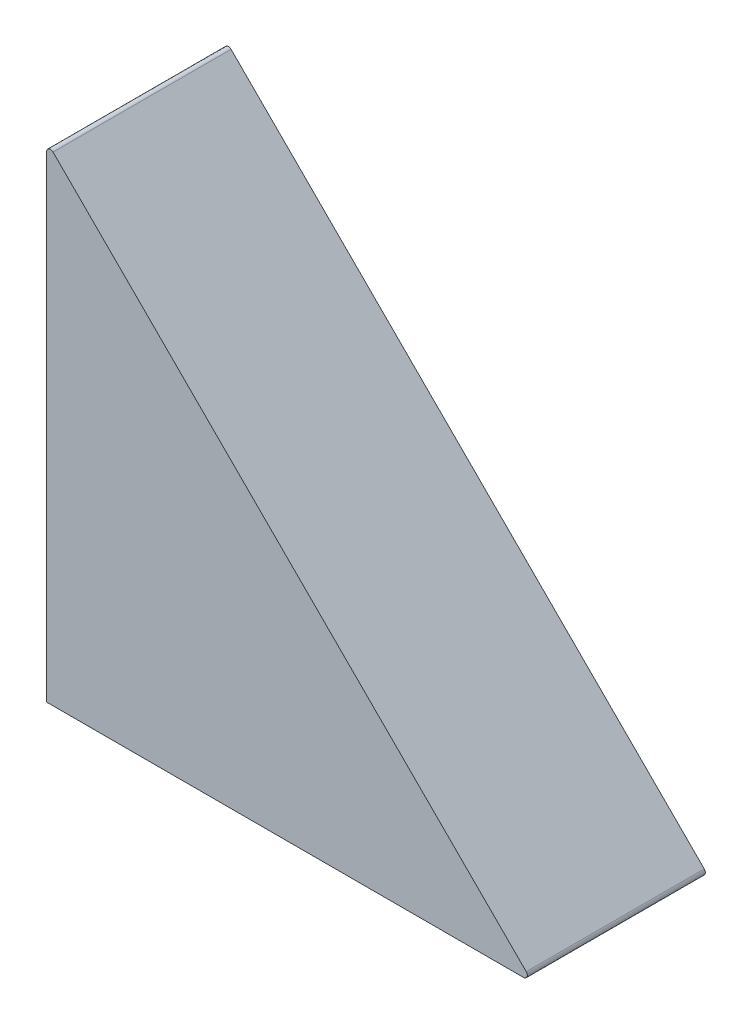
ISO-10303-21;
HEADER;
FILE_DESCRIPTION(('STEP AP214'),'2;1');
FILE_NAME('part.step','',(''),(''),'','','');
FILE_SCHEMA(('AUTOMOTIVE_DESIGN { 1 0 10303 214 1 1 1 1 }'));
ENDSEC;
DATA;
#1=APPLICATION_CONTEXT('core data for automotive mechanical design processes');
#2=APPLICATION_PROTOCOL_DEFINITION('international standard','automotive_design',2000,#1);
#3=PRODUCT_CONTEXT('',#1,'mechanical');
#4=PRODUCT('Part','Part','',(#3));
#5=PRODUCT_RELATED_PRODUCT_CATEGORY('part','',(#4));
#6=PRODUCT_DEFINITION_FORMATION('','',#4);
#7=PRODUCT_DEFINITION_CONTEXT('part definition',#1,'design');
#8=PRODUCT_DEFINITION('design','',#6,#7);
#9=PRODUCT_DEFINITION_SHAPE('','',#8);
#10=(LENGTH_UNIT() NAMED_UNIT(*) SI_UNIT(.MILLI.,.METRE.));
#11=(NAMED_UNIT(*) PLANE_ANGLE_UNIT() SI_UNIT($,.RADIAN.));
#12=(NAMED_UNIT(*) SI_UNIT($,.STERADIAN.) SOLID_ANGLE_UNIT());
#13=UNCERTAINTY_MEASURE_WITH_UNIT(LENGTH_MEASURE(1.E-05),#10,'distance_accuracy_value','');
#14=(GEOMETRIC_REPRESENTATION_CONTEXT(3) GLOBAL_UNCERTAINTY_ASSIGNED_CONTEXT((#13)) GLOBAL_UNIT_ASSIGNED_CONTEXT((#10,
#11,#12)) REPRESENTATION_CONTEXT('',''));
#15=CARTESIAN_POINT('',(0.,0.,0.));
#16=DIRECTION('',(0.,0.,1.));
#17=DIRECTION('',(1.,0.,0.));
#18=AXIS2_PLACEMENT_3D('',#15,#16,#17);
#19=CARTESIAN_POINT('',(0.,12.7585786437627,4.7625));
#20=DIRECTION('',(1.,0.,0.));
#21=DIRECTION('',(0.,1.,0.));
#22=AXIS2_PLACEMENT_3D('',#19,#20,#21);
#23=PLANE('',#22);
#24=DIRECTION('',(0.,-1.,0.));
#25=VECTOR('',#24,1.);
#26=CARTESIAN_POINT('',(0.,12.7585786437627,0.));
#27=LINE('',#26,#25);
#28=CARTESIAN_POINT('',(0.,12.7585786437627,0.));
#29=VERTEX_POINT('',#28);
#30=CARTESIAN_POINT('',(0.,0.,0.));
#31=VERTEX_POINT('',#30);
#32=EDGE_CURVE('E107',#29,#31,#27,.T.);
#33=ORIENTED_EDGE('',*,*,#32,.T.);
#34=DIRECTION('',(0.,0.,-1.));
#35=VECTOR('',#34,1.);
#36=CARTESIAN_POINT('',(0.,0.,4.7625));
#37=LINE('',#36,#35);
#38=CARTESIAN_POINT('',(0.,0.,4.7625));
#39=VERTEX_POINT('',#38);
#40=EDGE_CURVE('E11',#39,#31,#37,.T.);
#41=ORIENTED_EDGE('',*,*,#40,.F.);
#42=DIRECTION('',(0.,-1.,0.));
#43=VECTOR('',#42,1.);
#44=CARTESIAN_POINT('',(0.,12.7585786437627,4.7625));
#45=LINE('',#44,#43);
#46=CARTESIAN_POINT('',(0.,12.7585786437627,4.7625));
#47=VERTEX_POINT('',#46);
#48=EDGE_CURVE('E115',#47,#39,#45,.T.);
#49=ORIENTED_EDGE('',*,*,#48,.F.);
#50=DIRECTION('',(0.,0.,-1.));
#51=VECTOR('',#50,1.);
#52=CARTESIAN_POINT('',(0.,12.7585786437627,4.7625));
#53=LINE('',#52,#51);
#54=EDGE_CURVE('E103',#47,#29,#53,.T.);
#55=ORIENTED_EDGE('',*,*,#54,.T.);
#56=EDGE_LOOP('',(#33,#41,#49,#55));
#57=FACE_BOUND('',#56,.T.);
#58=ADVANCED_FACE('F33',(#57),#23,.F.);
#59=CARTESIAN_POINT('',(0.,0.,4.7625));
#60=DIRECTION('',(0.,1.,0.));
#61=DIRECTION('',(0.,0.,1.));
#62=AXIS2_PLACEMENT_3D('',#59,#60,#61);
#63=PLANE('',#62);
#64=DIRECTION('',(1.,0.,0.));
#65=VECTOR('',#64,1.);
#66=CARTESIAN_POINT('',(0.,0.,0.));
#67=LINE('',#66,#65);
#68=CARTESIAN_POINT('',(12.7585786437627,0.,0.));
#69=VERTEX_POINT('',#68);
#70=EDGE_CURVE('E110',#31,#69,#67,.T.);
#71=ORIENTED_EDGE('',*,*,#70,.T.);
#72=DIRECTION('',(0.,0.,-1.));
#73=VECTOR('',#72,1.);
#74=CARTESIAN_POINT('',(12.7585786437627,0.,4.7625));
#75=LINE('',#74,#73);
#76=CARTESIAN_POINT('',(12.7585786437627,0.,4.7625));
#77=VERTEX_POINT('',#76);
#78=EDGE_CURVE('E41',#77,#69,#75,.T.);
#79=ORIENTED_EDGE('',*,*,#78,.F.);
#80=DIRECTION('',(1.,0.,0.));
#81=VECTOR('',#80,1.);
#82=CARTESIAN_POINT('',(0.,0.,4.7625));
#83=LINE('',#82,#81);
#84=EDGE_CURVE('E83',#39,#77,#83,.T.);
#85=ORIENTED_EDGE('',*,*,#84,.F.);
#86=ORIENTED_EDGE('',*,*,#40,.T.);
#87=EDGE_LOOP('',(#71,#79,#85,#86));
#88=FACE_BOUND('',#87,.T.);
#89=ADVANCED_FACE('F134',(#88),#63,.F.);
#90=CARTESIAN_POINT('',(12.7585786437627,0.1,4.7625));
#91=DIRECTION('',(0.,0.,-1.));
#92=DIRECTION('',(-1.,0.,0.));
#93=AXIS2_PLACEMENT_3D('',#90,#91,#92);
#94=CYLINDRICAL_SURFACE('',#93,0.1);
#95=CARTESIAN_POINT('',(12.7585786437627,0.1,0.));
#96=DIRECTION('',(0.,0.,1.));
#97=DIRECTION('',(1.,0.,0.));
#98=AXIS2_PLACEMENT_3D('',#95,#96,#97);
#99=CIRCLE('',#98,0.1);
#100=CARTESIAN_POINT('',(12.8292893218813,0.170710678118656,0.));
#101=VERTEX_POINT('',#100);
#102=EDGE_CURVE('E98',#69,#101,#99,.T.);
#103=ORIENTED_EDGE('',*,*,#102,.T.);
#104=DIRECTION('',(0.,0.,-1.));
#105=VECTOR('',#104,1.);
#106=CARTESIAN_POINT('',(12.8292893218813,0.170710678118656,4.7625));
#107=LINE('',#106,#105);
#108=CARTESIAN_POINT('',(12.8292893218813,0.170710678118656,4.7625));
#109=VERTEX_POINT('',#108);
#110=EDGE_CURVE('E95',#109,#101,#107,.T.);
#111=ORIENTED_EDGE('',*,*,#110,.F.);
#112=CARTESIAN_POINT('',(12.7585786437627,0.1,4.7625));
#113=DIRECTION('',(0.,0.,1.));
#114=DIRECTION('',(1.,0.,0.));
#115=AXIS2_PLACEMENT_3D('',#112,#113,#114);
#116=CIRCLE('',#115,0.1);
#117=EDGE_CURVE('E87',#77,#109,#116,.T.);
#118=ORIENTED_EDGE('',*,*,#117,.F.);
#119=ORIENTED_EDGE('',*,*,#78,.T.);
#120=EDGE_LOOP('',(#103,#111,#118,#119));
#121=FACE_BOUND('',#120,.T.);
#122=ADVANCED_FACE('F96',(#121),#94,.T.);
#123=CARTESIAN_POINT('',(12.8292893218813,0.170710678118656,4.7625));
#124=DIRECTION('',(-0.707106781186548,-0.707106781186548,0.));
#125=DIRECTION('',(0.707106781186548,-0.707106781186548,0.));
#126=AXIS2_PLACEMENT_3D('',#123,#124,#125);
#127=PLANE('',#126);
#128=DIRECTION('',(-0.707106781186548,0.707106781186548,0.));
#129=VECTOR('',#128,1.);
#130=CARTESIAN_POINT('',(12.8292893218813,0.170710678118656,0.));
#131=LINE('',#130,#129);
#132=CARTESIAN_POINT('',(0.170710678118657,12.8292893218813,0.));
#133=VERTEX_POINT('',#132);
#134=EDGE_CURVE('E69',#101,#133,#131,.T.);
#135=ORIENTED_EDGE('',*,*,#134,.T.);
#136=DIRECTION('',(0.,0.,-1.));
#137=VECTOR('',#136,1.);
#138=CARTESIAN_POINT('',(0.170710678118657,12.8292893218813,4.7625));
#139=LINE('',#138,#137);
#140=CARTESIAN_POINT('',(0.170710678118657,12.8292893218813,4.7625));
#141=VERTEX_POINT('',#140);
#142=EDGE_CURVE('E99',#141,#133,#139,.T.);
#143=ORIENTED_EDGE('',*,*,#142,.F.);
#144=DIRECTION('',(-0.707106781186548,0.707106781186548,0.));
#145=VECTOR('',#144,1.);
#146=CARTESIAN_POINT('',(12.8292893218813,0.170710678118656,4.7625));
#147=LINE('',#146,#145);
#148=EDGE_CURVE('E91',#109,#141,#147,.T.);
#149=ORIENTED_EDGE('',*,*,#148,.F.);
#150=ORIENTED_EDGE('',*,*,#110,.T.);
#151=EDGE_LOOP('',(#135,#143,#149,#150));
#152=FACE_BOUND('',#151,.T.);
#153=ADVANCED_FACE('F101',(#152),#127,.F.);
#154=CARTESIAN_POINT('',(0.1,12.7585786437627,4.7625));
#155=DIRECTION('',(0.,0.,-1.));
#156=DIRECTION('',(-1.,0.,0.));
#157=AXIS2_PLACEMENT_3D('',#154,#155,#156);
#158=CYLINDRICAL_SURFACE('',#157,0.1);
#159=CARTESIAN_POINT('',(0.1,12.7585786437627,0.));
#160=DIRECTION('',(0.,0.,1.));
#161=DIRECTION('',(1.,0.,0.));
#162=AXIS2_PLACEMENT_3D('',#159,#160,#161);
#163=CIRCLE('',#162,0.1);
#164=EDGE_CURVE('E75',#133,#29,#163,.T.);
#165=ORIENTED_EDGE('',*,*,#164,.T.);
#166=ORIENTED_EDGE('',*,*,#54,.F.);
#167=CARTESIAN_POINT('',(0.1,12.7585786437627,4.7625));
#168=DIRECTION('',(0.,0.,1.));
#169=DIRECTION('',(1.,0.,0.));
#170=AXIS2_PLACEMENT_3D('',#167,#168,#169);
#171=CIRCLE('',#170,0.1);
#172=EDGE_CURVE('E49',#141,#47,#171,.T.);
#173=ORIENTED_EDGE('',*,*,#172,.F.);
#174=ORIENTED_EDGE('',*,*,#142,.T.);
#175=EDGE_LOOP('',(#165,#166,#173,#174));
#176=FACE_BOUND('',#175,.T.);
#177=ADVANCED_FACE('F123',(#176),#158,.T.);
#178=CARTESIAN_POINT('',(12.7585786437627,0.1,4.7625));
#179=DIRECTION('',(0.,0.,1.));
#180=DIRECTION('',(1.,0.,0.));
#181=AXIS2_PLACEMENT_3D('',#178,#179,#180);
#182=PLANE('',#181);
#183=ORIENTED_EDGE('',*,*,#48,.T.);
#184=ORIENTED_EDGE('',*,*,#84,.T.);
#185=ORIENTED_EDGE('',*,*,#117,.T.);
#186=ORIENTED_EDGE('',*,*,#148,.T.);
#187=ORIENTED_EDGE('',*,*,#172,.T.);
#188=EDGE_LOOP('',(#183,#184,#185,#186,#187));
#189=FACE_BOUND('',#188,.T.);
#190=ADVANCED_FACE('F89',(#189),#182,.T.);
#191=CARTESIAN_POINT('',(12.7585786437627,0.1,0.));
#192=DIRECTION('',(0.,0.,1.));
#193=DIRECTION('',(1.,0.,0.));
#194=AXIS2_PLACEMENT_3D('',#191,#192,#193);
#195=PLANE('',#194);
#196=ORIENTED_EDGE('',*,*,#32,.F.);
#197=ORIENTED_EDGE('',*,*,#164,.F.);
#198=ORIENTED_EDGE('',*,*,#134,.F.);
#199=ORIENTED_EDGE('',*,*,#102,.F.);
#200=ORIENTED_EDGE('',*,*,#70,.F.);
#201=EDGE_LOOP('',(#196,#197,#198,#199,#200));
#202=FACE_BOUND('',#201,.T.);
#203=ADVANCED_FACE('F119',(#202),#195,.F.);
#204=CLOSED_SHELL('',(#58,#89,#122,#153,#177,#190,#203));
#205=MANIFOLD_SOLID_BREP('B2',#204);
#206=ADVANCED_BREP_SHAPE_REPRESENTATION('',(#18,#205),#14);
#207=SHAPE_DEFINITION_REPRESENTATION(#9,#206);
ENDSEC;
END-ISO-10303-21;
